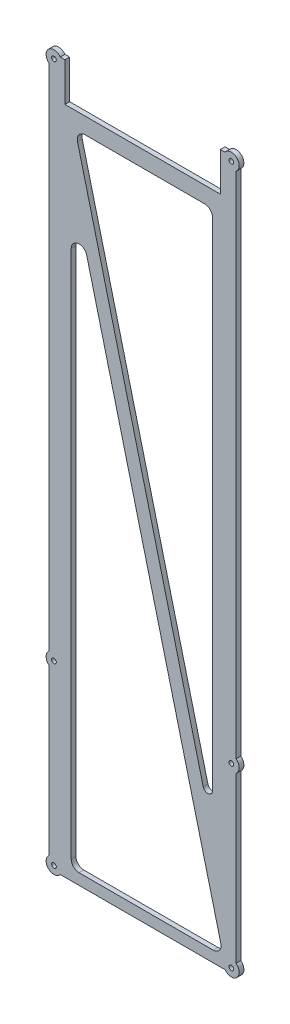
ISO-10303-21;
HEADER;
FILE_DESCRIPTION(('STEP AP214'),'2;1');
FILE_NAME('part.step','',(''),(''),'','','');
FILE_SCHEMA(('AUTOMOTIVE_DESIGN { 1 0 10303 214 1 1 1 1 }'));
ENDSEC;
DATA;
#1=APPLICATION_CONTEXT('core data for automotive mechanical design processes');
#2=APPLICATION_PROTOCOL_DEFINITION('international standard','automotive_design',2000,#1);
#3=PRODUCT_CONTEXT('',#1,'mechanical');
#4=PRODUCT('Part','Part','',(#3));
#5=PRODUCT_RELATED_PRODUCT_CATEGORY('part','',(#4));
#6=PRODUCT_DEFINITION_FORMATION('','',#4);
#7=PRODUCT_DEFINITION_CONTEXT('part definition',#1,'design');
#8=PRODUCT_DEFINITION('design','',#6,#7);
#9=PRODUCT_DEFINITION_SHAPE('','',#8);
#10=(LENGTH_UNIT() NAMED_UNIT(*) SI_UNIT(.MILLI.,.METRE.));
#11=(NAMED_UNIT(*) PLANE_ANGLE_UNIT() SI_UNIT($,.RADIAN.));
#12=(NAMED_UNIT(*) SI_UNIT($,.STERADIAN.) SOLID_ANGLE_UNIT());
#13=UNCERTAINTY_MEASURE_WITH_UNIT(LENGTH_MEASURE(1.E-05),#10,'distance_accuracy_value','');
#14=(GEOMETRIC_REPRESENTATION_CONTEXT(3) GLOBAL_UNCERTAINTY_ASSIGNED_CONTEXT((#13)) GLOBAL_UNIT_ASSIGNED_CONTEXT((#10,
#11,#12)) REPRESENTATION_CONTEXT('',''));
#15=CARTESIAN_POINT('',(0.,0.,0.));
#16=DIRECTION('',(0.,0.,1.));
#17=DIRECTION('',(1.,0.,0.));
#18=AXIS2_PLACEMENT_3D('',#15,#16,#17);
#19=CARTESIAN_POINT('',(0.,-445.,3.));
#20=DIRECTION('',(0.,0.,-1.));
#21=DIRECTION('',(-1.,0.,0.));
#22=AXIS2_PLACEMENT_3D('',#19,#20,#21);
#23=PLANE('',#22);
#24=CARTESIAN_POINT('',(96.0000000000001,-37.,3.));
#25=DIRECTION('',(0.,0.,1.));
#26=DIRECTION('',(1.,0.,0.));
#27=AXIS2_PLACEMENT_3D('',#24,#25,#26);
#28=CIRCLE('',#27,5.);
#29=CARTESIAN_POINT('',(101.,-37.,3.));
#30=VERTEX_POINT('',#29);
#31=CARTESIAN_POINT('',(96.,-32.,3.));
#32=VERTEX_POINT('',#31);
#33=EDGE_CURVE('E294',#30,#32,#28,.T.);
#34=ORIENTED_EDGE('',*,*,#33,.F.);
#35=DIRECTION('',(0.,1.,0.));
#36=VECTOR('',#35,1.);
#37=CARTESIAN_POINT('',(101.,-37.,3.));
#38=LINE('',#37,#36);
#39=CARTESIAN_POINT('',(101.,-353.303336100083,3.));
#40=VERTEX_POINT('',#39);
#41=EDGE_CURVE('E311',#40,#30,#38,.T.);
#42=ORIENTED_EDGE('',*,*,#41,.F.);
#43=CARTESIAN_POINT('',(98.0000000000001,-353.303336100084,3.));
#44=DIRECTION('',(0.,0.,1.));
#45=DIRECTION('',(-1.,0.,0.));
#46=AXIS2_PLACEMENT_3D('',#43,#44,#45);
#47=CIRCLE('',#46,3.00000000000001);
#48=CARTESIAN_POINT('',(95.0920444233756,-354.040760241524,3.));
#49=VERTEX_POINT('',#48);
#50=EDGE_CURVE('E307',#49,#40,#47,.T.);
#51=ORIENTED_EDGE('',*,*,#50,.F.);
#52=DIRECTION('',(0.245808047146874,-0.969318525541445,0.));
#53=VECTOR('',#52,1.);
#54=CARTESIAN_POINT('',(95.0920444233756,-354.040760241524,3.));
#55=LINE('',#54,#53);
#56=CARTESIAN_POINT('',(15.0058187759744,-38.2290402357344,3.));
#57=VERTEX_POINT('',#56);
#58=EDGE_CURVE('E304',#57,#49,#55,.T.);
#59=ORIENTED_EDGE('',*,*,#58,.F.);
#60=CARTESIAN_POINT('',(19.8524114036816,-37.,3.));
#61=DIRECTION('',(0.,0.,1.));
#62=DIRECTION('',(-1.,0.,0.));
#63=AXIS2_PLACEMENT_3D('',#60,#61,#62);
#64=CIRCLE('',#63,5.);
#65=CARTESIAN_POINT('',(19.8524114036817,-32.,3.));
#66=VERTEX_POINT('',#65);
#67=EDGE_CURVE('E301',#66,#57,#64,.T.);
#68=ORIENTED_EDGE('',*,*,#67,.F.);
#69=DIRECTION('',(-1.,0.,0.));
#70=VECTOR('',#69,1.);
#71=CARTESIAN_POINT('',(19.8524114036817,-32.,3.));
#72=LINE('',#71,#70);
#73=EDGE_CURVE('E297',#32,#66,#72,.T.);
#74=ORIENTED_EDGE('',*,*,#73,.F.);
#75=EDGE_LOOP('',(#34,#42,#51,#59,#68,#74));
#76=FACE_BOUND('',#75,.T.);
#77=CARTESIAN_POINT('',(0.,-445.,3.));
#78=DIRECTION('',(0.,0.,1.));
#79=DIRECTION('',(-1.,0.,0.));
#80=AXIS2_PLACEMENT_3D('',#77,#78,#79);
#81=CIRCLE('',#80,5.);
#82=CARTESIAN_POINT('',(-3.,-441.,3.));
#83=VERTEX_POINT('',#82);
#84=CARTESIAN_POINT('',(4.00000000000004,-448.,3.));
#85=VERTEX_POINT('',#84);
#86=EDGE_CURVE('E405',#83,#85,#81,.T.);
#87=ORIENTED_EDGE('',*,*,#86,.T.);
#88=DIRECTION('',(1.,0.,0.));
#89=VECTOR('',#88,1.);
#90=CARTESIAN_POINT('',(4.00000000000004,-448.,3.));
#91=LINE('',#90,#89);
#92=CARTESIAN_POINT('',(109.,-448.,3.));
#93=VERTEX_POINT('',#92);
#94=EDGE_CURVE('E409',#85,#93,#91,.T.);
#95=ORIENTED_EDGE('',*,*,#94,.T.);
#96=CARTESIAN_POINT('',(113.,-445.,3.));
#97=DIRECTION('',(0.,0.,1.));
#98=DIRECTION('',(1.,0.,0.));
#99=AXIS2_PLACEMENT_3D('',#96,#97,#98);
#100=CIRCLE('',#99,5.00000000000001);
#101=CARTESIAN_POINT('',(116.,-441.,3.));
#102=VERTEX_POINT('',#101);
#103=EDGE_CURVE('E413',#93,#102,#100,.T.);
#104=ORIENTED_EDGE('',*,*,#103,.T.);
#105=DIRECTION('',(0.,1.,0.));
#106=VECTOR('',#105,1.);
#107=CARTESIAN_POINT('',(116.,-441.,3.));
#108=LINE('',#107,#106);
#109=CARTESIAN_POINT('',(116.,-336.18,3.));
#110=VERTEX_POINT('',#109);
#111=EDGE_CURVE('E416',#102,#110,#108,.T.);
#112=ORIENTED_EDGE('',*,*,#111,.T.);
#113=CARTESIAN_POINT('',(113.,-332.18,3.));
#114=DIRECTION('',(0.,0.,1.));
#115=DIRECTION('',(1.,0.,0.));
#116=AXIS2_PLACEMENT_3D('',#113,#114,#115);
#117=CIRCLE('',#116,5.00000000000002);
#118=CARTESIAN_POINT('',(116.,-328.18,3.));
#119=VERTEX_POINT('',#118);
#120=EDGE_CURVE('E419',#110,#119,#117,.T.);
#121=ORIENTED_EDGE('',*,*,#120,.T.);
#122=DIRECTION('',(0.,1.,0.));
#123=VECTOR('',#122,1.);
#124=CARTESIAN_POINT('',(116.,-328.18,3.));
#125=LINE('',#124,#123);
#126=CARTESIAN_POINT('',(116.,-3.99999999999999,3.));
#127=VERTEX_POINT('',#126);
#128=EDGE_CURVE('E422',#119,#127,#125,.T.);
#129=ORIENTED_EDGE('',*,*,#128,.T.);
#130=CARTESIAN_POINT('',(113.,0.,3.));
#131=DIRECTION('',(0.,0.,1.));
#132=DIRECTION('',(-1.,0.,0.));
#133=AXIS2_PLACEMENT_3D('',#130,#131,#132);
#134=CIRCLE('',#133,5.);
#135=CARTESIAN_POINT('',(109.,2.99999999999999,3.));
#136=VERTEX_POINT('',#135);
#137=EDGE_CURVE('E425',#127,#136,#134,.T.);
#138=ORIENTED_EDGE('',*,*,#137,.T.);
#139=DIRECTION('',(-1.,0.,0.));
#140=VECTOR('',#139,1.);
#141=CARTESIAN_POINT('',(106.,3.,3.));
#142=LINE('',#141,#140);
#143=CARTESIAN_POINT('',(106.,3.,3.));
#144=VERTEX_POINT('',#143);
#145=EDGE_CURVE('E428',#136,#144,#142,.T.);
#146=ORIENTED_EDGE('',*,*,#145,.T.);
#147=DIRECTION('',(0.,-1.,0.));
#148=VECTOR('',#147,1.);
#149=CARTESIAN_POINT('',(106.,-21.6457553485476,3.));
#150=LINE('',#149,#148);
#151=CARTESIAN_POINT('',(106.,-21.6457553485476,3.));
#152=VERTEX_POINT('',#151);
#153=EDGE_CURVE('E431',#144,#152,#150,.T.);
#154=ORIENTED_EDGE('',*,*,#153,.T.);
#155=DIRECTION('',(-1.,0.,0.));
#156=VECTOR('',#155,1.);
#157=CARTESIAN_POINT('',(7.,-21.6457553485476,3.));
#158=LINE('',#157,#156);
#159=CARTESIAN_POINT('',(7.,-21.6457553485476,3.));
#160=VERTEX_POINT('',#159);
#161=EDGE_CURVE('E434',#152,#160,#158,.T.);
#162=ORIENTED_EDGE('',*,*,#161,.T.);
#163=DIRECTION('',(0.,1.,0.));
#164=VECTOR('',#163,1.);
#165=CARTESIAN_POINT('',(7.,3.,3.));
#166=LINE('',#165,#164);
#167=CARTESIAN_POINT('',(7.,3.,3.));
#168=VERTEX_POINT('',#167);
#169=EDGE_CURVE('E437',#160,#168,#166,.T.);
#170=ORIENTED_EDGE('',*,*,#169,.T.);
#171=DIRECTION('',(-1.,0.,0.));
#172=VECTOR('',#171,1.);
#173=CARTESIAN_POINT('',(7.,3.,3.));
#174=LINE('',#173,#172);
#175=CARTESIAN_POINT('',(4.,3.,3.));
#176=VERTEX_POINT('',#175);
#177=EDGE_CURVE('E440',#168,#176,#174,.T.);
#178=ORIENTED_EDGE('',*,*,#177,.T.);
#179=CARTESIAN_POINT('',(0.,0.,3.));
#180=DIRECTION('',(0.,0.,1.));
#181=DIRECTION('',(1.,0.,0.));
#182=AXIS2_PLACEMENT_3D('',#179,#180,#181);
#183=CIRCLE('',#182,5.);
#184=CARTESIAN_POINT('',(-3.,-4.,3.));
#185=VERTEX_POINT('',#184);
#186=EDGE_CURVE('E443',#176,#185,#183,.T.);
#187=ORIENTED_EDGE('',*,*,#186,.T.);
#188=DIRECTION('',(0.,-1.,0.));
#189=VECTOR('',#188,1.);
#190=CARTESIAN_POINT('',(-3.,-4.,3.));
#191=LINE('',#190,#189);
#192=CARTESIAN_POINT('',(-3.,-328.18,3.));
#193=VERTEX_POINT('',#192);
#194=EDGE_CURVE('E446',#185,#193,#191,.T.);
#195=ORIENTED_EDGE('',*,*,#194,.T.);
#196=CARTESIAN_POINT('',(0.,-332.18,3.));
#197=DIRECTION('',(0.,0.,1.));
#198=DIRECTION('',(-1.,0.,0.));
#199=AXIS2_PLACEMENT_3D('',#196,#197,#198);
#200=CIRCLE('',#199,4.99999999999995);
#201=CARTESIAN_POINT('',(-3.,-336.18,3.));
#202=VERTEX_POINT('',#201);
#203=EDGE_CURVE('E449',#193,#202,#200,.T.);
#204=ORIENTED_EDGE('',*,*,#203,.T.);
#205=DIRECTION('',(0.,-1.,0.));
#206=VECTOR('',#205,1.);
#207=CARTESIAN_POINT('',(-3.,-336.18,3.));
#208=LINE('',#207,#206);
#209=EDGE_CURVE('E452',#202,#83,#208,.T.);
#210=ORIENTED_EDGE('',*,*,#209,.T.);
#211=EDGE_LOOP('',(#87,#95,#104,#112,#121,#129,#138,#146,#154,#162,#170,#178,#187,#195,#204,#210));
#212=FACE_BOUND('',#211,.T.);
#213=CARTESIAN_POINT('',(0.,0.,3.));
#214=DIRECTION('',(0.,0.,1.));
#215=DIRECTION('',(1.,0.,0.));
#216=AXIS2_PLACEMENT_3D('',#213,#214,#215);
#217=CIRCLE('',#216,1.5);
#218=CARTESIAN_POINT('',(1.5,0.,3.));
#219=VERTEX_POINT('',#218);
#220=EDGE_CURVE('E397',#219,#219,#217,.T.);
#221=ORIENTED_EDGE('',*,*,#220,.F.);
#222=EDGE_LOOP('',(#221));
#223=FACE_BOUND('',#222,.T.);
#224=CARTESIAN_POINT('',(113.,0.,3.));
#225=DIRECTION('',(0.,0.,1.));
#226=DIRECTION('',(1.,0.,0.));
#227=AXIS2_PLACEMENT_3D('',#224,#225,#226);
#228=CIRCLE('',#227,1.5);
#229=CARTESIAN_POINT('',(114.5,0.,3.));
#230=VERTEX_POINT('',#229);
#231=EDGE_CURVE('E389',#230,#230,#228,.T.);
#232=ORIENTED_EDGE('',*,*,#231,.F.);
#233=EDGE_LOOP('',(#232));
#234=FACE_BOUND('',#233,.T.);
#235=CARTESIAN_POINT('',(113.,-445.,3.));
#236=DIRECTION('',(0.,0.,1.));
#237=DIRECTION('',(1.,0.,0.));
#238=AXIS2_PLACEMENT_3D('',#235,#236,#237);
#239=CIRCLE('',#238,1.5);
#240=CARTESIAN_POINT('',(114.5,-445.,3.));
#241=VERTEX_POINT('',#240);
#242=EDGE_CURVE('E381',#241,#241,#239,.T.);
#243=ORIENTED_EDGE('',*,*,#242,.F.);
#244=EDGE_LOOP('',(#243));
#245=FACE_BOUND('',#244,.T.);
#246=CARTESIAN_POINT('',(0.,-445.,3.));
#247=DIRECTION('',(0.,0.,1.));
#248=DIRECTION('',(1.,0.,0.));
#249=AXIS2_PLACEMENT_3D('',#246,#247,#248);
#250=CIRCLE('',#249,1.5);
#251=CARTESIAN_POINT('',(1.5,-445.,3.));
#252=VERTEX_POINT('',#251);
#253=EDGE_CURVE('E373',#252,#252,#250,.T.);
#254=ORIENTED_EDGE('',*,*,#253,.F.);
#255=EDGE_LOOP('',(#254));
#256=FACE_BOUND('',#255,.T.);
#257=CARTESIAN_POINT('',(0.,-332.18,3.));
#258=DIRECTION('',(0.,0.,1.));
#259=DIRECTION('',(1.,0.,0.));
#260=AXIS2_PLACEMENT_3D('',#257,#258,#259);
#261=CIRCLE('',#260,1.5);
#262=CARTESIAN_POINT('',(1.5,-332.18,3.));
#263=VERTEX_POINT('',#262);
#264=EDGE_CURVE('E365',#263,#263,#261,.T.);
#265=ORIENTED_EDGE('',*,*,#264,.F.);
#266=EDGE_LOOP('',(#265));
#267=FACE_BOUND('',#266,.T.);
#268=CARTESIAN_POINT('',(113.,-332.18,3.));
#269=DIRECTION('',(0.,0.,1.));
#270=DIRECTION('',(1.,0.,0.));
#271=AXIS2_PLACEMENT_3D('',#268,#269,#270);
#272=CIRCLE('',#271,1.5);
#273=CARTESIAN_POINT('',(114.5,-332.18,3.));
#274=VERTEX_POINT('',#273);
#275=EDGE_CURVE('E357',#274,#274,#272,.T.);
#276=ORIENTED_EDGE('',*,*,#275,.F.);
#277=EDGE_LOOP('',(#276));
#278=FACE_BOUND('',#277,.T.);
#279=CARTESIAN_POINT('',(101.432829736687,-436.,3.));
#280=DIRECTION('',(0.,0.,1.));
#281=DIRECTION('',(-1.,0.,0.));
#282=AXIS2_PLACEMENT_3D('',#279,#280,#281);
#283=CIRCLE('',#282,5.);
#284=CARTESIAN_POINT('',(101.432829736687,-441.,3.));
#285=VERTEX_POINT('',#284);
#286=CARTESIAN_POINT('',(106.279422364394,-434.770959764266,3.));
#287=VERTEX_POINT('',#286);
#288=EDGE_CURVE('E225',#285,#287,#283,.T.);
#289=ORIENTED_EDGE('',*,*,#288,.F.);
#290=DIRECTION('',(1.,0.,0.));
#291=VECTOR('',#290,1.);
#292=CARTESIAN_POINT('',(16.,-441.,3.));
#293=LINE('',#292,#291);
#294=CARTESIAN_POINT('',(16.,-441.,3.));
#295=VERTEX_POINT('',#294);
#296=EDGE_CURVE('E260',#295,#285,#293,.T.);
#297=ORIENTED_EDGE('',*,*,#296,.F.);
#298=CARTESIAN_POINT('',(16.,-436.,3.));
#299=DIRECTION('',(0.,0.,1.));
#300=DIRECTION('',(-1.,0.,0.));
#301=AXIS2_PLACEMENT_3D('',#298,#299,#300);
#302=CIRCLE('',#301,5.);
#303=CARTESIAN_POINT('',(11.,-436.,3.));
#304=VERTEX_POINT('',#303);
#305=EDGE_CURVE('E257',#304,#295,#302,.T.);
#306=ORIENTED_EDGE('',*,*,#305,.F.);
#307=DIRECTION('',(0.,-1.,0.));
#308=VECTOR('',#307,1.);
#309=CARTESIAN_POINT('',(11.,-436.,3.));
#310=LINE('',#309,#308);
#311=CARTESIAN_POINT('',(11.,-99.1045016043882,3.));
#312=VERTEX_POINT('',#311);
#313=EDGE_CURVE('E252',#312,#304,#310,.T.);
#314=ORIENTED_EDGE('',*,*,#313,.F.);
#315=CARTESIAN_POINT('',(16.,-99.1045016043871,3.));
#316=DIRECTION('',(0.,0.,1.));
#317=DIRECTION('',(-1.,0.,0.));
#318=AXIS2_PLACEMENT_3D('',#315,#316,#317);
#319=CIRCLE('',#318,5.);
#320=CARTESIAN_POINT('',(20.8465926277075,-97.8754613686538,3.));
#321=VERTEX_POINT('',#320);
#322=EDGE_CURVE('E248',#321,#312,#319,.T.);
#323=ORIENTED_EDGE('',*,*,#322,.F.);
#324=DIRECTION('',(-0.245808047146874,0.969318525541445,0.));
#325=VECTOR('',#324,1.);
#326=CARTESIAN_POINT('',(20.8465926277075,-97.8754613686538,3.));
#327=LINE('',#326,#325);
#328=EDGE_CURVE('E234',#287,#321,#327,.T.);
#329=ORIENTED_EDGE('',*,*,#328,.F.);
#330=EDGE_LOOP('',(#289,#297,#306,#314,#323,#329));
#331=FACE_BOUND('',#330,.T.);
#332=ADVANCED_FACE('F39',(#76,#212,#223,#234,#245,#256,#267,#278,#331),#23,.F.);
#333=CARTESIAN_POINT('',(0.,-445.,0.));
#334=DIRECTION('',(0.,0.,-1.));
#335=DIRECTION('',(-1.,0.,0.));
#336=AXIS2_PLACEMENT_3D('',#333,#334,#335);
#337=PLANE('',#336);
#338=CARTESIAN_POINT('',(0.,-332.18,0.));
#339=DIRECTION('',(0.,0.,1.));
#340=DIRECTION('',(1.,0.,0.));
#341=AXIS2_PLACEMENT_3D('',#338,#339,#340);
#342=CIRCLE('',#341,1.5);
#343=CARTESIAN_POINT('',(1.5,-332.18,0.));
#344=VERTEX_POINT('',#343);
#345=EDGE_CURVE('E361',#344,#344,#342,.T.);
#346=ORIENTED_EDGE('',*,*,#345,.T.);
#347=EDGE_LOOP('',(#346));
#348=FACE_BOUND('',#347,.T.);
#349=CARTESIAN_POINT('',(113.,-445.,0.));
#350=DIRECTION('',(0.,0.,1.));
#351=DIRECTION('',(1.,0.,0.));
#352=AXIS2_PLACEMENT_3D('',#349,#350,#351);
#353=CIRCLE('',#352,1.5);
#354=CARTESIAN_POINT('',(114.5,-445.,0.));
#355=VERTEX_POINT('',#354);
#356=EDGE_CURVE('E377',#355,#355,#353,.T.);
#357=ORIENTED_EDGE('',*,*,#356,.T.);
#358=EDGE_LOOP('',(#357));
#359=FACE_BOUND('',#358,.T.);
#360=CARTESIAN_POINT('',(0.,0.,0.));
#361=DIRECTION('',(0.,0.,1.));
#362=DIRECTION('',(1.,0.,0.));
#363=AXIS2_PLACEMENT_3D('',#360,#361,#362);
#364=CIRCLE('',#363,1.5);
#365=CARTESIAN_POINT('',(1.5,0.,0.));
#366=VERTEX_POINT('',#365);
#367=EDGE_CURVE('E393',#366,#366,#364,.T.);
#368=ORIENTED_EDGE('',*,*,#367,.T.);
#369=EDGE_LOOP('',(#368));
#370=FACE_BOUND('',#369,.T.);
#371=CARTESIAN_POINT('',(0.,-445.,0.));
#372=DIRECTION('',(0.,0.,1.));
#373=DIRECTION('',(-1.,0.,0.));
#374=AXIS2_PLACEMENT_3D('',#371,#372,#373);
#375=CIRCLE('',#374,5.);
#376=CARTESIAN_POINT('',(-3.,-441.,0.));
#377=VERTEX_POINT('',#376);
#378=CARTESIAN_POINT('',(4.00000000000004,-448.,0.));
#379=VERTEX_POINT('',#378);
#380=EDGE_CURVE('E401',#377,#379,#375,.T.);
#381=ORIENTED_EDGE('',*,*,#380,.F.);
#382=DIRECTION('',(0.,-1.,0.));
#383=VECTOR('',#382,1.);
#384=CARTESIAN_POINT('',(-3.,-336.18,0.));
#385=LINE('',#384,#383);
#386=CARTESIAN_POINT('',(-3.,-336.18,0.));
#387=VERTEX_POINT('',#386);
#388=EDGE_CURVE('E410',#387,#377,#385,.T.);
#389=ORIENTED_EDGE('',*,*,#388,.F.);
#390=CARTESIAN_POINT('',(0.,-332.18,0.));
#391=DIRECTION('',(0.,0.,1.));
#392=DIRECTION('',(-1.,0.,0.));
#393=AXIS2_PLACEMENT_3D('',#390,#391,#392);
#394=CIRCLE('',#393,4.99999999999995);
#395=CARTESIAN_POINT('',(-3.,-328.18,0.));
#396=VERTEX_POINT('',#395);
#397=EDGE_CURVE('E498',#396,#387,#394,.T.);
#398=ORIENTED_EDGE('',*,*,#397,.F.);
#399=DIRECTION('',(0.,-1.,0.));
#400=VECTOR('',#399,1.);
#401=CARTESIAN_POINT('',(-3.,-4.,0.));
#402=LINE('',#401,#400);
#403=CARTESIAN_POINT('',(-3.,-4.,0.));
#404=VERTEX_POINT('',#403);
#405=EDGE_CURVE('E495',#404,#396,#402,.T.);
#406=ORIENTED_EDGE('',*,*,#405,.F.);
#407=CARTESIAN_POINT('',(0.,0.,0.));
#408=DIRECTION('',(0.,0.,1.));
#409=DIRECTION('',(1.,0.,0.));
#410=AXIS2_PLACEMENT_3D('',#407,#408,#409);
#411=CIRCLE('',#410,5.);
#412=CARTESIAN_POINT('',(4.,3.,0.));
#413=VERTEX_POINT('',#412);
#414=EDGE_CURVE('E492',#413,#404,#411,.T.);
#415=ORIENTED_EDGE('',*,*,#414,.F.);
#416=DIRECTION('',(-1.,0.,0.));
#417=VECTOR('',#416,1.);
#418=CARTESIAN_POINT('',(7.,3.,0.));
#419=LINE('',#418,#417);
#420=CARTESIAN_POINT('',(7.,3.,0.));
#421=VERTEX_POINT('',#420);
#422=EDGE_CURVE('E489',#421,#413,#419,.T.);
#423=ORIENTED_EDGE('',*,*,#422,.F.);
#424=DIRECTION('',(0.,1.,0.));
#425=VECTOR('',#424,1.);
#426=CARTESIAN_POINT('',(7.,3.,0.));
#427=LINE('',#426,#425);
#428=CARTESIAN_POINT('',(7.,-21.6457553485476,0.));
#429=VERTEX_POINT('',#428);
#430=EDGE_CURVE('E486',#429,#421,#427,.T.);
#431=ORIENTED_EDGE('',*,*,#430,.F.);
#432=DIRECTION('',(-1.,0.,0.));
#433=VECTOR('',#432,1.);
#434=CARTESIAN_POINT('',(7.,-21.6457553485476,0.));
#435=LINE('',#434,#433);
#436=CARTESIAN_POINT('',(106.,-21.6457553485476,0.));
#437=VERTEX_POINT('',#436);
#438=EDGE_CURVE('E483',#437,#429,#435,.T.);
#439=ORIENTED_EDGE('',*,*,#438,.F.);
#440=DIRECTION('',(0.,-1.,0.));
#441=VECTOR('',#440,1.);
#442=CARTESIAN_POINT('',(106.,-21.6457553485476,0.));
#443=LINE('',#442,#441);
#444=CARTESIAN_POINT('',(106.,3.,0.));
#445=VERTEX_POINT('',#444);
#446=EDGE_CURVE('E480',#445,#437,#443,.T.);
#447=ORIENTED_EDGE('',*,*,#446,.F.);
#448=DIRECTION('',(-1.,0.,0.));
#449=VECTOR('',#448,1.);
#450=CARTESIAN_POINT('',(106.,3.,0.));
#451=LINE('',#450,#449);
#452=CARTESIAN_POINT('',(109.,2.99999999999999,0.));
#453=VERTEX_POINT('',#452);
#454=EDGE_CURVE('E477',#453,#445,#451,.T.);
#455=ORIENTED_EDGE('',*,*,#454,.F.);
#456=CARTESIAN_POINT('',(113.,0.,0.));
#457=DIRECTION('',(0.,0.,1.));
#458=DIRECTION('',(-1.,0.,0.));
#459=AXIS2_PLACEMENT_3D('',#456,#457,#458);
#460=CIRCLE('',#459,5.);
#461=CARTESIAN_POINT('',(116.,-3.99999999999999,0.));
#462=VERTEX_POINT('',#461);
#463=EDGE_CURVE('E474',#462,#453,#460,.T.);
#464=ORIENTED_EDGE('',*,*,#463,.F.);
#465=DIRECTION('',(0.,1.,0.));
#466=VECTOR('',#465,1.);
#467=CARTESIAN_POINT('',(116.,-328.18,0.));
#468=LINE('',#467,#466);
#469=CARTESIAN_POINT('',(116.,-328.18,0.));
#470=VERTEX_POINT('',#469);
#471=EDGE_CURVE('E471',#470,#462,#468,.T.);
#472=ORIENTED_EDGE('',*,*,#471,.F.);
#473=CARTESIAN_POINT('',(113.,-332.18,0.));
#474=DIRECTION('',(0.,0.,1.));
#475=DIRECTION('',(1.,0.,0.));
#476=AXIS2_PLACEMENT_3D('',#473,#474,#475);
#477=CIRCLE('',#476,5.00000000000002);
#478=CARTESIAN_POINT('',(116.,-336.18,0.));
#479=VERTEX_POINT('',#478);
#480=EDGE_CURVE('E468',#479,#470,#477,.T.);
#481=ORIENTED_EDGE('',*,*,#480,.F.);
#482=DIRECTION('',(0.,1.,0.));
#483=VECTOR('',#482,1.);
#484=CARTESIAN_POINT('',(116.,-441.,0.));
#485=LINE('',#484,#483);
#486=CARTESIAN_POINT('',(116.,-441.,0.));
#487=VERTEX_POINT('',#486);
#488=EDGE_CURVE('E465',#487,#479,#485,.T.);
#489=ORIENTED_EDGE('',*,*,#488,.F.);
#490=CARTESIAN_POINT('',(113.,-445.,0.));
#491=DIRECTION('',(0.,0.,1.));
#492=DIRECTION('',(1.,0.,0.));
#493=AXIS2_PLACEMENT_3D('',#490,#491,#492);
#494=CIRCLE('',#493,5.00000000000001);
#495=CARTESIAN_POINT('',(109.,-448.,0.));
#496=VERTEX_POINT('',#495);
#497=EDGE_CURVE('E462',#496,#487,#494,.T.);
#498=ORIENTED_EDGE('',*,*,#497,.F.);
#499=DIRECTION('',(1.,0.,0.));
#500=VECTOR('',#499,1.);
#501=CARTESIAN_POINT('',(4.00000000000004,-448.,0.));
#502=LINE('',#501,#500);
#503=EDGE_CURVE('E459',#379,#496,#502,.T.);
#504=ORIENTED_EDGE('',*,*,#503,.F.);
#505=EDGE_LOOP('',(#381,#389,#398,#406,#415,#423,#431,#439,#447,#455,#464,#472,#481,#489,#498,#504));
#506=FACE_BOUND('',#505,.T.);
#507=CARTESIAN_POINT('',(113.,0.,0.));
#508=DIRECTION('',(0.,0.,1.));
#509=DIRECTION('',(1.,0.,0.));
#510=AXIS2_PLACEMENT_3D('',#507,#508,#509);
#511=CIRCLE('',#510,1.5);
#512=CARTESIAN_POINT('',(114.5,0.,0.));
#513=VERTEX_POINT('',#512);
#514=EDGE_CURVE('E385',#513,#513,#511,.T.);
#515=ORIENTED_EDGE('',*,*,#514,.T.);
#516=EDGE_LOOP('',(#515));
#517=FACE_BOUND('',#516,.T.);
#518=CARTESIAN_POINT('',(0.,-445.,0.));
#519=DIRECTION('',(0.,0.,1.));
#520=DIRECTION('',(1.,0.,0.));
#521=AXIS2_PLACEMENT_3D('',#518,#519,#520);
#522=CIRCLE('',#521,1.5);
#523=CARTESIAN_POINT('',(1.5,-445.,0.));
#524=VERTEX_POINT('',#523);
#525=EDGE_CURVE('E369',#524,#524,#522,.T.);
#526=ORIENTED_EDGE('',*,*,#525,.T.);
#527=EDGE_LOOP('',(#526));
#528=FACE_BOUND('',#527,.T.);
#529=CARTESIAN_POINT('',(113.,-332.18,0.));
#530=DIRECTION('',(0.,0.,1.));
#531=DIRECTION('',(1.,0.,0.));
#532=AXIS2_PLACEMENT_3D('',#529,#530,#531);
#533=CIRCLE('',#532,1.5);
#534=CARTESIAN_POINT('',(114.5,-332.18,0.));
#535=VERTEX_POINT('',#534);
#536=EDGE_CURVE('E356',#535,#535,#533,.T.);
#537=ORIENTED_EDGE('',*,*,#536,.T.);
#538=EDGE_LOOP('',(#537));
#539=FACE_BOUND('',#538,.T.);
#540=DIRECTION('',(0.,1.,0.));
#541=VECTOR('',#540,1.);
#542=CARTESIAN_POINT('',(101.,-37.,0.));
#543=LINE('',#542,#541);
#544=CARTESIAN_POINT('',(101.,-353.303336100083,0.));
#545=VERTEX_POINT('',#544);
#546=CARTESIAN_POINT('',(101.,-37.,0.));
#547=VERTEX_POINT('',#546);
#548=EDGE_CURVE('E298',#545,#547,#543,.T.);
#549=ORIENTED_EDGE('',*,*,#548,.T.);
#550=CARTESIAN_POINT('',(96.0000000000001,-37.,0.));
#551=DIRECTION('',(0.,0.,1.));
#552=DIRECTION('',(1.,0.,0.));
#553=AXIS2_PLACEMENT_3D('',#550,#551,#552);
#554=CIRCLE('',#553,5.);
#555=CARTESIAN_POINT('',(96.,-32.,0.));
#556=VERTEX_POINT('',#555);
#557=EDGE_CURVE('E243',#547,#556,#554,.T.);
#558=ORIENTED_EDGE('',*,*,#557,.T.);
#559=DIRECTION('',(-1.,0.,0.));
#560=VECTOR('',#559,1.);
#561=CARTESIAN_POINT('',(19.8524114036817,-32.,0.));
#562=LINE('',#561,#560);
#563=CARTESIAN_POINT('',(19.8524114036817,-32.,0.));
#564=VERTEX_POINT('',#563);
#565=EDGE_CURVE('E318',#556,#564,#562,.T.);
#566=ORIENTED_EDGE('',*,*,#565,.T.);
#567=CARTESIAN_POINT('',(19.8524114036816,-37.,0.));
#568=DIRECTION('',(0.,0.,1.));
#569=DIRECTION('',(-1.,0.,0.));
#570=AXIS2_PLACEMENT_3D('',#567,#568,#569);
#571=CIRCLE('',#570,5.);
#572=CARTESIAN_POINT('',(15.0058187759744,-38.2290402357344,0.));
#573=VERTEX_POINT('',#572);
#574=EDGE_CURVE('E322',#564,#573,#571,.T.);
#575=ORIENTED_EDGE('',*,*,#574,.T.);
#576=DIRECTION('',(0.245808047146874,-0.969318525541445,0.));
#577=VECTOR('',#576,1.);
#578=CARTESIAN_POINT('',(95.0920444233756,-354.040760241524,0.));
#579=LINE('',#578,#577);
#580=CARTESIAN_POINT('',(95.0920444233756,-354.040760241524,0.));
#581=VERTEX_POINT('',#580);
#582=EDGE_CURVE('E326',#573,#581,#579,.T.);
#583=ORIENTED_EDGE('',*,*,#582,.T.);
#584=CARTESIAN_POINT('',(98.0000000000001,-353.303336100084,0.));
#585=DIRECTION('',(0.,0.,1.));
#586=DIRECTION('',(-1.,0.,0.));
#587=AXIS2_PLACEMENT_3D('',#584,#585,#586);
#588=CIRCLE('',#587,3.00000000000001);
#589=EDGE_CURVE('E330',#581,#545,#588,.T.);
#590=ORIENTED_EDGE('',*,*,#589,.T.);
#591=EDGE_LOOP('',(#549,#558,#566,#575,#583,#590));
#592=FACE_BOUND('',#591,.T.);
#593=DIRECTION('',(1.,0.,0.));
#594=VECTOR('',#593,1.);
#595=CARTESIAN_POINT('',(16.,-441.,0.));
#596=LINE('',#595,#594);
#597=CARTESIAN_POINT('',(16.,-441.,0.));
#598=VERTEX_POINT('',#597);
#599=CARTESIAN_POINT('',(101.432829736687,-441.,0.));
#600=VERTEX_POINT('',#599);
#601=EDGE_CURVE('E235',#598,#600,#596,.T.);
#602=ORIENTED_EDGE('',*,*,#601,.T.);
#603=CARTESIAN_POINT('',(101.432829736687,-436.,0.));
#604=DIRECTION('',(0.,0.,1.));
#605=DIRECTION('',(-1.,0.,0.));
#606=AXIS2_PLACEMENT_3D('',#603,#604,#605);
#607=CIRCLE('',#606,5.);
#608=CARTESIAN_POINT('',(106.279422364394,-434.770959764266,0.));
#609=VERTEX_POINT('',#608);
#610=EDGE_CURVE('E63',#600,#609,#607,.T.);
#611=ORIENTED_EDGE('',*,*,#610,.T.);
#612=DIRECTION('',(-0.245808047146874,0.969318525541445,0.));
#613=VECTOR('',#612,1.);
#614=CARTESIAN_POINT('',(20.8465926277075,-97.8754613686538,0.));
#615=LINE('',#614,#613);
#616=CARTESIAN_POINT('',(20.8465926277075,-97.8754613686538,0.));
#617=VERTEX_POINT('',#616);
#618=EDGE_CURVE('E241',#609,#617,#615,.T.);
#619=ORIENTED_EDGE('',*,*,#618,.T.);
#620=CARTESIAN_POINT('',(16.,-99.1045016043871,0.));
#621=DIRECTION('',(0.,0.,1.));
#622=DIRECTION('',(-1.,0.,0.));
#623=AXIS2_PLACEMENT_3D('',#620,#621,#622);
#624=CIRCLE('',#623,5.);
#625=CARTESIAN_POINT('',(11.,-99.1045016043882,0.));
#626=VERTEX_POINT('',#625);
#627=EDGE_CURVE('E267',#617,#626,#624,.T.);
#628=ORIENTED_EDGE('',*,*,#627,.T.);
#629=DIRECTION('',(0.,-1.,0.));
#630=VECTOR('',#629,1.);
#631=CARTESIAN_POINT('',(11.,-436.,0.));
#632=LINE('',#631,#630);
#633=CARTESIAN_POINT('',(11.,-436.,0.));
#634=VERTEX_POINT('',#633);
#635=EDGE_CURVE('E271',#626,#634,#632,.T.);
#636=ORIENTED_EDGE('',*,*,#635,.T.);
#637=CARTESIAN_POINT('',(16.,-436.,0.));
#638=DIRECTION('',(0.,0.,1.));
#639=DIRECTION('',(-1.,0.,0.));
#640=AXIS2_PLACEMENT_3D('',#637,#638,#639);
#641=CIRCLE('',#640,5.);
#642=EDGE_CURVE('E275',#634,#598,#641,.T.);
#643=ORIENTED_EDGE('',*,*,#642,.T.);
#644=EDGE_LOOP('',(#602,#611,#619,#628,#636,#643));
#645=FACE_BOUND('',#644,.T.);
#646=ADVANCED_FACE('F569',(#348,#359,#370,#506,#517,#528,#539,#592,#645),#337,.T.);
#647=CARTESIAN_POINT('',(0.,-445.,3.));
#648=DIRECTION('',(0.,0.,-1.));
#649=DIRECTION('',(-1.,0.,0.));
#650=AXIS2_PLACEMENT_3D('',#647,#648,#649);
#651=CYLINDRICAL_SURFACE('',#650,5.);
#652=ORIENTED_EDGE('',*,*,#380,.T.);
#653=DIRECTION('',(0.,0.,-1.));
#654=VECTOR('',#653,1.);
#655=CARTESIAN_POINT('',(4.00000000000004,-448.,3.));
#656=LINE('',#655,#654);
#657=EDGE_CURVE('E11',#85,#379,#656,.T.);
#658=ORIENTED_EDGE('',*,*,#657,.F.);
#659=ORIENTED_EDGE('',*,*,#86,.F.);
#660=DIRECTION('',(0.,0.,-1.));
#661=VECTOR('',#660,1.);
#662=CARTESIAN_POINT('',(-3.,-441.,3.));
#663=LINE('',#662,#661);
#664=EDGE_CURVE('E455',#83,#377,#663,.T.);
#665=ORIENTED_EDGE('',*,*,#664,.T.);
#666=EDGE_LOOP('',(#652,#658,#659,#665));
#667=FACE_BOUND('',#666,.T.);
#668=ADVANCED_FACE('F41',(#667),#651,.T.);
#669=CARTESIAN_POINT('',(4.00000000000004,-448.,3.));
#670=DIRECTION('',(0.,1.,0.));
#671=DIRECTION('',(0.,0.,1.));
#672=AXIS2_PLACEMENT_3D('',#669,#670,#671);
#673=PLANE('',#672);
#674=ORIENTED_EDGE('',*,*,#503,.T.);
#675=DIRECTION('',(0.,0.,-1.));
#676=VECTOR('',#675,1.);
#677=CARTESIAN_POINT('',(109.,-448.,3.));
#678=LINE('',#677,#676);
#679=EDGE_CURVE('E48',#93,#496,#678,.T.);
#680=ORIENTED_EDGE('',*,*,#679,.F.);
#681=ORIENTED_EDGE('',*,*,#94,.F.);
#682=ORIENTED_EDGE('',*,*,#657,.T.);
#683=EDGE_LOOP('',(#674,#680,#681,#682));
#684=FACE_BOUND('',#683,.T.);
#685=ADVANCED_FACE('F587',(#684),#673,.F.);
#686=CARTESIAN_POINT('',(113.,-445.,3.));
#687=DIRECTION('',(0.,0.,-1.));
#688=DIRECTION('',(-1.,0.,0.));
#689=AXIS2_PLACEMENT_3D('',#686,#687,#688);
#690=CYLINDRICAL_SURFACE('',#689,5.00000000000001);
#691=ORIENTED_EDGE('',*,*,#497,.T.);
#692=DIRECTION('',(0.,0.,-1.));
#693=VECTOR('',#692,1.);
#694=CARTESIAN_POINT('',(116.,-441.,3.));
#695=LINE('',#694,#693);
#696=EDGE_CURVE('E554',#102,#487,#695,.T.);
#697=ORIENTED_EDGE('',*,*,#696,.F.);
#698=ORIENTED_EDGE('',*,*,#103,.F.);
#699=ORIENTED_EDGE('',*,*,#679,.T.);
#700=EDGE_LOOP('',(#691,#697,#698,#699));
#701=FACE_BOUND('',#700,.T.);
#702=ADVANCED_FACE('F563',(#701),#690,.T.);
#703=CARTESIAN_POINT('',(116.,-441.,3.));
#704=DIRECTION('',(-1.,0.,0.));
#705=DIRECTION('',(0.,-1.,0.));
#706=AXIS2_PLACEMENT_3D('',#703,#704,#705);
#707=PLANE('',#706);
#708=ORIENTED_EDGE('',*,*,#488,.T.);
#709=DIRECTION('',(0.,0.,-1.));
#710=VECTOR('',#709,1.);
#711=CARTESIAN_POINT('',(116.,-336.18,3.));
#712=LINE('',#711,#710);
#713=EDGE_CURVE('E550',#110,#479,#712,.T.);
#714=ORIENTED_EDGE('',*,*,#713,.F.);
#715=ORIENTED_EDGE('',*,*,#111,.F.);
#716=ORIENTED_EDGE('',*,*,#696,.T.);
#717=EDGE_LOOP('',(#708,#714,#715,#716));
#718=FACE_BOUND('',#717,.T.);
#719=ADVANCED_FACE('F575',(#718),#707,.F.);
#720=CARTESIAN_POINT('',(113.,-332.18,3.));
#721=DIRECTION('',(0.,0.,-1.));
#722=DIRECTION('',(-1.,0.,0.));
#723=AXIS2_PLACEMENT_3D('',#720,#721,#722);
#724=CYLINDRICAL_SURFACE('',#723,5.00000000000002);
#725=ORIENTED_EDGE('',*,*,#480,.T.);
#726=DIRECTION('',(0.,0.,-1.));
#727=VECTOR('',#726,1.);
#728=CARTESIAN_POINT('',(116.,-328.18,3.));
#729=LINE('',#728,#727);
#730=EDGE_CURVE('E546',#119,#470,#729,.T.);
#731=ORIENTED_EDGE('',*,*,#730,.F.);
#732=ORIENTED_EDGE('',*,*,#120,.F.);
#733=ORIENTED_EDGE('',*,*,#713,.T.);
#734=EDGE_LOOP('',(#725,#731,#732,#733));
#735=FACE_BOUND('',#734,.T.);
#736=ADVANCED_FACE('F579',(#735),#724,.T.);
#737=CARTESIAN_POINT('',(116.,-328.18,3.));
#738=DIRECTION('',(-1.,0.,0.));
#739=DIRECTION('',(0.,-1.,0.));
#740=AXIS2_PLACEMENT_3D('',#737,#738,#739);
#741=PLANE('',#740);
#742=ORIENTED_EDGE('',*,*,#471,.T.);
#743=DIRECTION('',(0.,0.,-1.));
#744=VECTOR('',#743,1.);
#745=CARTESIAN_POINT('',(116.,-3.99999999999999,3.));
#746=LINE('',#745,#744);
#747=EDGE_CURVE('E542',#127,#462,#746,.T.);
#748=ORIENTED_EDGE('',*,*,#747,.F.);
#749=ORIENTED_EDGE('',*,*,#128,.F.);
#750=ORIENTED_EDGE('',*,*,#730,.T.);
#751=EDGE_LOOP('',(#742,#748,#749,#750));
#752=FACE_BOUND('',#751,.T.);
#753=ADVANCED_FACE('F640',(#752),#741,.F.);
#754=CARTESIAN_POINT('',(113.,0.,3.));
#755=DIRECTION('',(0.,0.,-1.));
#756=DIRECTION('',(-1.,0.,0.));
#757=AXIS2_PLACEMENT_3D('',#754,#755,#756);
#758=CYLINDRICAL_SURFACE('',#757,5.);
#759=ORIENTED_EDGE('',*,*,#463,.T.);
#760=DIRECTION('',(0.,0.,-1.));
#761=VECTOR('',#760,1.);
#762=CARTESIAN_POINT('',(109.,2.99999999999999,3.));
#763=LINE('',#762,#761);
#764=EDGE_CURVE('E538',#136,#453,#763,.T.);
#765=ORIENTED_EDGE('',*,*,#764,.F.);
#766=ORIENTED_EDGE('',*,*,#137,.F.);
#767=ORIENTED_EDGE('',*,*,#747,.T.);
#768=EDGE_LOOP('',(#759,#765,#766,#767));
#769=FACE_BOUND('',#768,.T.);
#770=ADVANCED_FACE('F637',(#769),#758,.T.);
#771=CARTESIAN_POINT('',(106.,3.,3.));
#772=DIRECTION('',(0.,-1.,0.));
#773=DIRECTION('',(1.,0.,0.));
#774=AXIS2_PLACEMENT_3D('',#771,#772,#773);
#775=PLANE('',#774);
#776=ORIENTED_EDGE('',*,*,#454,.T.);
#777=DIRECTION('',(0.,0.,-1.));
#778=VECTOR('',#777,1.);
#779=CARTESIAN_POINT('',(106.,3.,3.));
#780=LINE('',#779,#778);
#781=EDGE_CURVE('E534',#144,#445,#780,.T.);
#782=ORIENTED_EDGE('',*,*,#781,.F.);
#783=ORIENTED_EDGE('',*,*,#145,.F.);
#784=ORIENTED_EDGE('',*,*,#764,.T.);
#785=EDGE_LOOP('',(#776,#782,#783,#784));
#786=FACE_BOUND('',#785,.T.);
#787=ADVANCED_FACE('F633',(#786),#775,.F.);
#788=CARTESIAN_POINT('',(106.,-21.6457553485476,3.));
#789=DIRECTION('',(1.,0.,0.));
#790=DIRECTION('',(0.,0.,-1.));
#791=AXIS2_PLACEMENT_3D('',#788,#789,#790);
#792=PLANE('',#791);
#793=ORIENTED_EDGE('',*,*,#446,.T.);
#794=DIRECTION('',(0.,0.,-1.));
#795=VECTOR('',#794,1.);
#796=CARTESIAN_POINT('',(106.,-21.6457553485476,3.));
#797=LINE('',#796,#795);
#798=EDGE_CURVE('E530',#152,#437,#797,.T.);
#799=ORIENTED_EDGE('',*,*,#798,.F.);
#800=ORIENTED_EDGE('',*,*,#153,.F.);
#801=ORIENTED_EDGE('',*,*,#781,.T.);
#802=EDGE_LOOP('',(#793,#799,#800,#801));
#803=FACE_BOUND('',#802,.T.);
#804=ADVANCED_FACE('F629',(#803),#792,.F.);
#805=CARTESIAN_POINT('',(7.,-21.6457553485476,3.));
#806=DIRECTION('',(0.,-1.,0.));
#807=DIRECTION('',(0.,0.,-1.));
#808=AXIS2_PLACEMENT_3D('',#805,#806,#807);
#809=PLANE('',#808);
#810=ORIENTED_EDGE('',*,*,#438,.T.);
#811=DIRECTION('',(0.,0.,-1.));
#812=VECTOR('',#811,1.);
#813=CARTESIAN_POINT('',(7.,-21.6457553485476,3.));
#814=LINE('',#813,#812);
#815=EDGE_CURVE('E526',#160,#429,#814,.T.);
#816=ORIENTED_EDGE('',*,*,#815,.F.);
#817=ORIENTED_EDGE('',*,*,#161,.F.);
#818=ORIENTED_EDGE('',*,*,#798,.T.);
#819=EDGE_LOOP('',(#810,#816,#817,#818));
#820=FACE_BOUND('',#819,.T.);
#821=ADVANCED_FACE('F624',(#820),#809,.F.);
#822=CARTESIAN_POINT('',(7.,3.,3.));
#823=DIRECTION('',(-1.,0.,0.));
#824=DIRECTION('',(0.,0.,1.));
#825=AXIS2_PLACEMENT_3D('',#822,#823,#824);
#826=PLANE('',#825);
#827=ORIENTED_EDGE('',*,*,#430,.T.);
#828=DIRECTION('',(0.,0.,-1.));
#829=VECTOR('',#828,1.);
#830=CARTESIAN_POINT('',(7.,3.,3.));
#831=LINE('',#830,#829);
#832=EDGE_CURVE('E522',#168,#421,#831,.T.);
#833=ORIENTED_EDGE('',*,*,#832,.F.);
#834=ORIENTED_EDGE('',*,*,#169,.F.);
#835=ORIENTED_EDGE('',*,*,#815,.T.);
#836=EDGE_LOOP('',(#827,#833,#834,#835));
#837=FACE_BOUND('',#836,.T.);
#838=ADVANCED_FACE('F618',(#837),#826,.F.);
#839=CARTESIAN_POINT('',(7.,3.,3.));
#840=DIRECTION('',(0.,-1.,0.));
#841=DIRECTION('',(1.,0.,0.));
#842=AXIS2_PLACEMENT_3D('',#839,#840,#841);
#843=PLANE('',#842);
#844=ORIENTED_EDGE('',*,*,#422,.T.);
#845=DIRECTION('',(0.,0.,-1.));
#846=VECTOR('',#845,1.);
#847=CARTESIAN_POINT('',(4.,3.,3.));
#848=LINE('',#847,#846);
#849=EDGE_CURVE('E518',#176,#413,#848,.T.);
#850=ORIENTED_EDGE('',*,*,#849,.F.);
#851=ORIENTED_EDGE('',*,*,#177,.F.);
#852=ORIENTED_EDGE('',*,*,#832,.T.);
#853=EDGE_LOOP('',(#844,#850,#851,#852));
#854=FACE_BOUND('',#853,.T.);
#855=ADVANCED_FACE('F614',(#854),#843,.F.);
#856=CARTESIAN_POINT('',(0.,0.,3.));
#857=DIRECTION('',(0.,0.,-1.));
#858=DIRECTION('',(-1.,0.,0.));
#859=AXIS2_PLACEMENT_3D('',#856,#857,#858);
#860=CYLINDRICAL_SURFACE('',#859,5.);
#861=ORIENTED_EDGE('',*,*,#414,.T.);
#862=DIRECTION('',(0.,0.,-1.));
#863=VECTOR('',#862,1.);
#864=CARTESIAN_POINT('',(-3.,-4.,3.));
#865=LINE('',#864,#863);
#866=EDGE_CURVE('E514',#185,#404,#865,.T.);
#867=ORIENTED_EDGE('',*,*,#866,.F.);
#868=ORIENTED_EDGE('',*,*,#186,.F.);
#869=ORIENTED_EDGE('',*,*,#849,.T.);
#870=EDGE_LOOP('',(#861,#867,#868,#869));
#871=FACE_BOUND('',#870,.T.);
#872=ADVANCED_FACE('F609',(#871),#860,.T.);
#873=CARTESIAN_POINT('',(-3.,-4.,3.));
#874=DIRECTION('',(1.,0.,0.));
#875=DIRECTION('',(0.,1.,0.));
#876=AXIS2_PLACEMENT_3D('',#873,#874,#875);
#877=PLANE('',#876);
#878=ORIENTED_EDGE('',*,*,#405,.T.);
#879=DIRECTION('',(0.,0.,-1.));
#880=VECTOR('',#879,1.);
#881=CARTESIAN_POINT('',(-3.,-328.18,3.));
#882=LINE('',#881,#880);
#883=EDGE_CURVE('E510',#193,#396,#882,.T.);
#884=ORIENTED_EDGE('',*,*,#883,.F.);
#885=ORIENTED_EDGE('',*,*,#194,.F.);
#886=ORIENTED_EDGE('',*,*,#866,.T.);
#887=EDGE_LOOP('',(#878,#884,#885,#886));
#888=FACE_BOUND('',#887,.T.);
#889=ADVANCED_FACE('F603',(#888),#877,.F.);
#890=CARTESIAN_POINT('',(0.,-332.18,3.));
#891=DIRECTION('',(0.,0.,-1.));
#892=DIRECTION('',(-1.,0.,0.));
#893=AXIS2_PLACEMENT_3D('',#890,#891,#892);
#894=CYLINDRICAL_SURFACE('',#893,4.99999999999995);
#895=ORIENTED_EDGE('',*,*,#397,.T.);
#896=DIRECTION('',(0.,0.,-1.));
#897=VECTOR('',#896,1.);
#898=CARTESIAN_POINT('',(-3.,-336.18,3.));
#899=LINE('',#898,#897);
#900=EDGE_CURVE('E506',#202,#387,#899,.T.);
#901=ORIENTED_EDGE('',*,*,#900,.F.);
#902=ORIENTED_EDGE('',*,*,#203,.F.);
#903=ORIENTED_EDGE('',*,*,#883,.T.);
#904=EDGE_LOOP('',(#895,#901,#902,#903));
#905=FACE_BOUND('',#904,.T.);
#906=ADVANCED_FACE('F599',(#905),#894,.T.);
#907=CARTESIAN_POINT('',(-3.,-336.18,3.));
#908=DIRECTION('',(1.,0.,0.));
#909=DIRECTION('',(0.,1.,0.));
#910=AXIS2_PLACEMENT_3D('',#907,#908,#909);
#911=PLANE('',#910);
#912=ORIENTED_EDGE('',*,*,#388,.T.);
#913=ORIENTED_EDGE('',*,*,#664,.F.);
#914=ORIENTED_EDGE('',*,*,#209,.F.);
#915=ORIENTED_EDGE('',*,*,#900,.T.);
#916=EDGE_LOOP('',(#912,#913,#914,#915));
#917=FACE_BOUND('',#916,.T.);
#918=ADVANCED_FACE('F594',(#917),#911,.F.);
#919=CARTESIAN_POINT('',(0.,0.,3.));
#920=DIRECTION('',(0.,0.,-1.));
#921=DIRECTION('',(-1.,0.,0.));
#922=AXIS2_PLACEMENT_3D('',#919,#920,#921);
#923=CYLINDRICAL_SURFACE('',#922,1.5);
#924=ORIENTED_EDGE('',*,*,#220,.T.);
#925=EDGE_LOOP('',(#924));
#926=FACE_BOUND('',#925,.T.);
#927=ORIENTED_EDGE('',*,*,#367,.F.);
#928=EDGE_LOOP('',(#927));
#929=FACE_BOUND('',#928,.T.);
#930=ADVANCED_FACE('F659',(#926,#929),#923,.F.);
#931=CARTESIAN_POINT('',(113.,0.,3.));
#932=DIRECTION('',(0.,0.,-1.));
#933=DIRECTION('',(-1.,0.,0.));
#934=AXIS2_PLACEMENT_3D('',#931,#932,#933);
#935=CYLINDRICAL_SURFACE('',#934,1.5);
#936=ORIENTED_EDGE('',*,*,#231,.T.);
#937=EDGE_LOOP('',(#936));
#938=FACE_BOUND('',#937,.T.);
#939=ORIENTED_EDGE('',*,*,#514,.F.);
#940=EDGE_LOOP('',(#939));
#941=FACE_BOUND('',#940,.T.);
#942=ADVANCED_FACE('F721',(#938,#941),#935,.F.);
#943=CARTESIAN_POINT('',(113.,-445.,3.));
#944=DIRECTION('',(0.,0.,-1.));
#945=DIRECTION('',(-1.,0.,0.));
#946=AXIS2_PLACEMENT_3D('',#943,#944,#945);
#947=CYLINDRICAL_SURFACE('',#946,1.5);
#948=ORIENTED_EDGE('',*,*,#242,.T.);
#949=EDGE_LOOP('',(#948));
#950=FACE_BOUND('',#949,.T.);
#951=ORIENTED_EDGE('',*,*,#356,.F.);
#952=EDGE_LOOP('',(#951));
#953=FACE_BOUND('',#952,.T.);
#954=ADVANCED_FACE('F728',(#950,#953),#947,.F.);
#955=CARTESIAN_POINT('',(0.,-445.,3.));
#956=DIRECTION('',(0.,0.,-1.));
#957=DIRECTION('',(-1.,0.,0.));
#958=AXIS2_PLACEMENT_3D('',#955,#956,#957);
#959=CYLINDRICAL_SURFACE('',#958,1.5);
#960=ORIENTED_EDGE('',*,*,#253,.T.);
#961=EDGE_LOOP('',(#960));
#962=FACE_BOUND('',#961,.T.);
#963=ORIENTED_EDGE('',*,*,#525,.F.);
#964=EDGE_LOOP('',(#963));
#965=FACE_BOUND('',#964,.T.);
#966=ADVANCED_FACE('F735',(#962,#965),#959,.F.);
#967=CARTESIAN_POINT('',(0.,-332.18,3.));
#968=DIRECTION('',(0.,0.,-1.));
#969=DIRECTION('',(-1.,0.,0.));
#970=AXIS2_PLACEMENT_3D('',#967,#968,#969);
#971=CYLINDRICAL_SURFACE('',#970,1.5);
#972=ORIENTED_EDGE('',*,*,#264,.T.);
#973=EDGE_LOOP('',(#972));
#974=FACE_BOUND('',#973,.T.);
#975=ORIENTED_EDGE('',*,*,#345,.F.);
#976=EDGE_LOOP('',(#975));
#977=FACE_BOUND('',#976,.T.);
#978=ADVANCED_FACE('F743',(#974,#977),#971,.F.);
#979=CARTESIAN_POINT('',(113.,-332.18,3.));
#980=DIRECTION('',(0.,0.,-1.));
#981=DIRECTION('',(-1.,0.,0.));
#982=AXIS2_PLACEMENT_3D('',#979,#980,#981);
#983=CYLINDRICAL_SURFACE('',#982,1.5);
#984=ORIENTED_EDGE('',*,*,#275,.T.);
#985=EDGE_LOOP('',(#984));
#986=FACE_BOUND('',#985,.T.);
#987=ORIENTED_EDGE('',*,*,#536,.F.);
#988=EDGE_LOOP('',(#987));
#989=FACE_BOUND('',#988,.T.);
#990=ADVANCED_FACE('F751',(#986,#989),#983,.F.);
#991=CARTESIAN_POINT('',(96.0000000000001,-37.,3.));
#992=DIRECTION('',(0.,0.,-1.));
#993=DIRECTION('',(-1.,0.,0.));
#994=AXIS2_PLACEMENT_3D('',#991,#992,#993);
#995=CYLINDRICAL_SURFACE('',#994,5.);
#996=ORIENTED_EDGE('',*,*,#557,.F.);
#997=DIRECTION('',(0.,0.,-1.));
#998=VECTOR('',#997,1.);
#999=CARTESIAN_POINT('',(101.,-37.,3.));
#1000=LINE('',#999,#998);
#1001=EDGE_CURVE('E314',#30,#547,#1000,.T.);
#1002=ORIENTED_EDGE('',*,*,#1001,.F.);
#1003=ORIENTED_EDGE('',*,*,#33,.T.);
#1004=DIRECTION('',(0.,0.,-1.));
#1005=VECTOR('',#1004,1.);
#1006=CARTESIAN_POINT('',(96.,-32.,3.));
#1007=LINE('',#1006,#1005);
#1008=EDGE_CURVE('E352',#32,#556,#1007,.T.);
#1009=ORIENTED_EDGE('',*,*,#1008,.T.);
#1010=EDGE_LOOP('',(#996,#1002,#1003,#1009));
#1011=FACE_BOUND('',#1010,.T.);
#1012=ADVANCED_FACE('F759',(#1011),#995,.F.);
#1013=CARTESIAN_POINT('',(19.8524114036817,-32.,3.));
#1014=DIRECTION('',(0.,-1.,0.));
#1015=DIRECTION('',(0.,0.,-1.));
#1016=AXIS2_PLACEMENT_3D('',#1013,#1014,#1015);
#1017=PLANE('',#1016);
#1018=ORIENTED_EDGE('',*,*,#565,.F.);
#1019=ORIENTED_EDGE('',*,*,#1008,.F.);
#1020=ORIENTED_EDGE('',*,*,#73,.T.);
#1021=DIRECTION('',(0.,0.,-1.));
#1022=VECTOR('',#1021,1.);
#1023=CARTESIAN_POINT('',(19.8524114036817,-32.,3.));
#1024=LINE('',#1023,#1022);
#1025=EDGE_CURVE('E349',#66,#564,#1024,.T.);
#1026=ORIENTED_EDGE('',*,*,#1025,.T.);
#1027=EDGE_LOOP('',(#1018,#1019,#1020,#1026));
#1028=FACE_BOUND('',#1027,.T.);
#1029=ADVANCED_FACE('F767',(#1028),#1017,.T.);
#1030=CARTESIAN_POINT('',(19.8524114036816,-37.,3.));
#1031=DIRECTION('',(0.,0.,-1.));
#1032=DIRECTION('',(-1.,0.,0.));
#1033=AXIS2_PLACEMENT_3D('',#1030,#1031,#1032);
#1034=CYLINDRICAL_SURFACE('',#1033,5.);
#1035=ORIENTED_EDGE('',*,*,#574,.F.);
#1036=ORIENTED_EDGE('',*,*,#1025,.F.);
#1037=ORIENTED_EDGE('',*,*,#67,.T.);
#1038=DIRECTION('',(0.,0.,-1.));
#1039=VECTOR('',#1038,1.);
#1040=CARTESIAN_POINT('',(15.0058187759744,-38.2290402357344,3.));
#1041=LINE('',#1040,#1039);
#1042=EDGE_CURVE('E346',#57,#573,#1041,.T.);
#1043=ORIENTED_EDGE('',*,*,#1042,.T.);
#1044=EDGE_LOOP('',(#1035,#1036,#1037,#1043));
#1045=FACE_BOUND('',#1044,.T.);
#1046=ADVANCED_FACE('F775',(#1045),#1034,.F.);
#1047=CARTESIAN_POINT('',(95.0920444233756,-354.040760241524,3.));
#1048=DIRECTION('',(0.969318525541445,0.245808047146874,0.));
#1049=DIRECTION('',(-0.245808047146874,0.969318525541445,0.));
#1050=AXIS2_PLACEMENT_3D('',#1047,#1048,#1049);
#1051=PLANE('',#1050);
#1052=ORIENTED_EDGE('',*,*,#582,.F.);
#1053=ORIENTED_EDGE('',*,*,#1042,.F.);
#1054=ORIENTED_EDGE('',*,*,#58,.T.);
#1055=DIRECTION('',(0.,0.,-1.));
#1056=VECTOR('',#1055,1.);
#1057=CARTESIAN_POINT('',(95.0920444233756,-354.040760241524,3.));
#1058=LINE('',#1057,#1056);
#1059=EDGE_CURVE('E343',#49,#581,#1058,.T.);
#1060=ORIENTED_EDGE('',*,*,#1059,.T.);
#1061=EDGE_LOOP('',(#1052,#1053,#1054,#1060));
#1062=FACE_BOUND('',#1061,.T.);
#1063=ADVANCED_FACE('F783',(#1062),#1051,.T.);
#1064=CARTESIAN_POINT('',(98.0000000000001,-353.303336100084,3.));
#1065=DIRECTION('',(0.,0.,-1.));
#1066=DIRECTION('',(-1.,0.,0.));
#1067=AXIS2_PLACEMENT_3D('',#1064,#1065,#1066);
#1068=CYLINDRICAL_SURFACE('',#1067,3.00000000000001);
#1069=ORIENTED_EDGE('',*,*,#589,.F.);
#1070=ORIENTED_EDGE('',*,*,#1059,.F.);
#1071=ORIENTED_EDGE('',*,*,#50,.T.);
#1072=DIRECTION('',(0.,0.,-1.));
#1073=VECTOR('',#1072,1.);
#1074=CARTESIAN_POINT('',(101.,-353.303336100083,3.));
#1075=LINE('',#1074,#1073);
#1076=EDGE_CURVE('E340',#40,#545,#1075,.T.);
#1077=ORIENTED_EDGE('',*,*,#1076,.T.);
#1078=EDGE_LOOP('',(#1069,#1070,#1071,#1077));
#1079=FACE_BOUND('',#1078,.T.);
#1080=ADVANCED_FACE('F791',(#1079),#1068,.F.);
#1081=CARTESIAN_POINT('',(101.,-37.,3.));
#1082=DIRECTION('',(-1.,0.,0.));
#1083=DIRECTION('',(0.,0.,1.));
#1084=AXIS2_PLACEMENT_3D('',#1081,#1082,#1083);
#1085=PLANE('',#1084);
#1086=ORIENTED_EDGE('',*,*,#548,.F.);
#1087=ORIENTED_EDGE('',*,*,#1076,.F.);
#1088=ORIENTED_EDGE('',*,*,#41,.T.);
#1089=ORIENTED_EDGE('',*,*,#1001,.T.);
#1090=EDGE_LOOP('',(#1086,#1087,#1088,#1089));
#1091=FACE_BOUND('',#1090,.T.);
#1092=ADVANCED_FACE('F799',(#1091),#1085,.T.);
#1093=CARTESIAN_POINT('',(101.432829736687,-436.,3.));
#1094=DIRECTION('',(0.,0.,-1.));
#1095=DIRECTION('',(-1.,0.,0.));
#1096=AXIS2_PLACEMENT_3D('',#1093,#1094,#1095);
#1097=CYLINDRICAL_SURFACE('',#1096,5.);
#1098=ORIENTED_EDGE('',*,*,#610,.F.);
#1099=DIRECTION('',(0.,0.,-1.));
#1100=VECTOR('',#1099,1.);
#1101=CARTESIAN_POINT('',(101.432829736687,-441.,3.));
#1102=LINE('',#1101,#1100);
#1103=EDGE_CURVE('E229',#285,#600,#1102,.T.);
#1104=ORIENTED_EDGE('',*,*,#1103,.F.);
#1105=ORIENTED_EDGE('',*,*,#288,.T.);
#1106=DIRECTION('',(0.,0.,-1.));
#1107=VECTOR('',#1106,1.);
#1108=CARTESIAN_POINT('',(106.279422364394,-434.770959764266,3.));
#1109=LINE('',#1108,#1107);
#1110=EDGE_CURVE('E228',#287,#609,#1109,.T.);
#1111=ORIENTED_EDGE('',*,*,#1110,.T.);
#1112=EDGE_LOOP('',(#1098,#1104,#1105,#1111));
#1113=FACE_BOUND('',#1112,.T.);
#1114=ADVANCED_FACE('F227',(#1113),#1097,.F.);
#1115=CARTESIAN_POINT('',(20.8465926277075,-97.8754613686538,3.));
#1116=DIRECTION('',(-0.969318525541445,-0.245808047146874,0.));
#1117=DIRECTION('',(0.245808047146874,-0.969318525541445,0.));
#1118=AXIS2_PLACEMENT_3D('',#1115,#1116,#1117);
#1119=PLANE('',#1118);
#1120=ORIENTED_EDGE('',*,*,#618,.F.);
#1121=ORIENTED_EDGE('',*,*,#1110,.F.);
#1122=ORIENTED_EDGE('',*,*,#328,.T.);
#1123=DIRECTION('',(0.,0.,-1.));
#1124=VECTOR('',#1123,1.);
#1125=CARTESIAN_POINT('',(20.8465926277075,-97.8754613686538,3.));
#1126=LINE('',#1125,#1124);
#1127=EDGE_CURVE('E244',#321,#617,#1126,.T.);
#1128=ORIENTED_EDGE('',*,*,#1127,.T.);
#1129=EDGE_LOOP('',(#1120,#1121,#1122,#1128));
#1130=FACE_BOUND('',#1129,.T.);
#1131=ADVANCED_FACE('F238',(#1130),#1119,.T.);
#1132=CARTESIAN_POINT('',(16.,-99.1045016043871,3.));
#1133=DIRECTION('',(0.,0.,-1.));
#1134=DIRECTION('',(-1.,0.,0.));
#1135=AXIS2_PLACEMENT_3D('',#1132,#1133,#1134);
#1136=CYLINDRICAL_SURFACE('',#1135,5.);
#1137=ORIENTED_EDGE('',*,*,#627,.F.);
#1138=ORIENTED_EDGE('',*,*,#1127,.F.);
#1139=ORIENTED_EDGE('',*,*,#322,.T.);
#1140=DIRECTION('',(0.,0.,-1.));
#1141=VECTOR('',#1140,1.);
#1142=CARTESIAN_POINT('',(11.,-99.1045016043882,3.));
#1143=LINE('',#1142,#1141);
#1144=EDGE_CURVE('E289',#312,#626,#1143,.T.);
#1145=ORIENTED_EDGE('',*,*,#1144,.T.);
#1146=EDGE_LOOP('',(#1137,#1138,#1139,#1145));
#1147=FACE_BOUND('',#1146,.T.);
#1148=ADVANCED_FACE('F820',(#1147),#1136,.F.);
#1149=CARTESIAN_POINT('',(11.,-436.,3.));
#1150=DIRECTION('',(1.,0.,0.));
#1151=DIRECTION('',(0.,0.,-1.));
#1152=AXIS2_PLACEMENT_3D('',#1149,#1150,#1151);
#1153=PLANE('',#1152);
#1154=ORIENTED_EDGE('',*,*,#635,.F.);
#1155=ORIENTED_EDGE('',*,*,#1144,.F.);
#1156=ORIENTED_EDGE('',*,*,#313,.T.);
#1157=DIRECTION('',(0.,0.,-1.));
#1158=VECTOR('',#1157,1.);
#1159=CARTESIAN_POINT('',(11.,-436.,3.));
#1160=LINE('',#1159,#1158);
#1161=EDGE_CURVE('E286',#304,#634,#1160,.T.);
#1162=ORIENTED_EDGE('',*,*,#1161,.T.);
#1163=EDGE_LOOP('',(#1154,#1155,#1156,#1162));
#1164=FACE_BOUND('',#1163,.T.);
#1165=ADVANCED_FACE('F827',(#1164),#1153,.T.);
#1166=CARTESIAN_POINT('',(16.,-436.,3.));
#1167=DIRECTION('',(0.,0.,-1.));
#1168=DIRECTION('',(-1.,0.,0.));
#1169=AXIS2_PLACEMENT_3D('',#1166,#1167,#1168);
#1170=CYLINDRICAL_SURFACE('',#1169,5.);
#1171=ORIENTED_EDGE('',*,*,#642,.F.);
#1172=ORIENTED_EDGE('',*,*,#1161,.F.);
#1173=ORIENTED_EDGE('',*,*,#305,.T.);
#1174=DIRECTION('',(0.,0.,-1.));
#1175=VECTOR('',#1174,1.);
#1176=CARTESIAN_POINT('',(16.,-441.,3.));
#1177=LINE('',#1176,#1175);
#1178=EDGE_CURVE('E55',#295,#598,#1177,.T.);
#1179=ORIENTED_EDGE('',*,*,#1178,.T.);
#1180=EDGE_LOOP('',(#1171,#1172,#1173,#1179));
#1181=FACE_BOUND('',#1180,.T.);
#1182=ADVANCED_FACE('F835',(#1181),#1170,.F.);
#1183=CARTESIAN_POINT('',(16.,-441.,3.));
#1184=DIRECTION('',(0.,1.,0.));
#1185=DIRECTION('',(0.,0.,1.));
#1186=AXIS2_PLACEMENT_3D('',#1183,#1184,#1185);
#1187=PLANE('',#1186);
#1188=ORIENTED_EDGE('',*,*,#601,.F.);
#1189=ORIENTED_EDGE('',*,*,#1178,.F.);
#1190=ORIENTED_EDGE('',*,*,#296,.T.);
#1191=ORIENTED_EDGE('',*,*,#1103,.T.);
#1192=EDGE_LOOP('',(#1188,#1189,#1190,#1191));
#1193=FACE_BOUND('',#1192,.T.);
#1194=ADVANCED_FACE('F843',(#1193),#1187,.T.);
#1195=CLOSED_SHELL('',(#332,#646,#668,#685,#702,#719,#736,#753,#770,#787,#804,#821,#838,#855,
#872,#889,#906,#918,#930,#942,#954,#966,#978,#990,#1012,#1029,#1046,#1063,#1080,#1092,#1114,
#1131,#1148,#1165,#1182,#1194));
#1196=MANIFOLD_SOLID_BREP('B2',#1195);
#1197=ADVANCED_BREP_SHAPE_REPRESENTATION('',(#18,#1196),#14);
#1198=SHAPE_DEFINITION_REPRESENTATION(#9,#1197);
ENDSEC;
END-ISO-10303-21;
